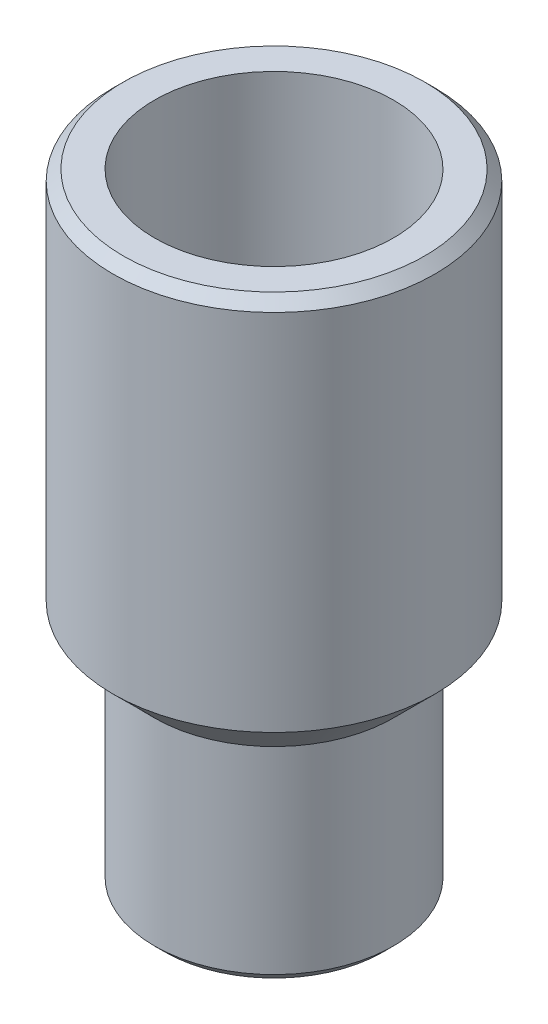
ISO-10303-21;
HEADER;
FILE_DESCRIPTION(('STEP AP214'),'2;1');
FILE_NAME('part.step','',(''),(''),'','','');
FILE_SCHEMA(('AUTOMOTIVE_DESIGN { 1 0 10303 214 1 1 1 1 }'));
ENDSEC;
DATA;
#1=APPLICATION_CONTEXT('core data for automotive mechanical design processes');
#2=APPLICATION_PROTOCOL_DEFINITION('international standard','automotive_design',2000,#1);
#3=PRODUCT_CONTEXT('',#1,'mechanical');
#4=PRODUCT('Part','Part','',(#3));
#5=PRODUCT_RELATED_PRODUCT_CATEGORY('part','',(#4));
#6=PRODUCT_DEFINITION_FORMATION('','',#4);
#7=PRODUCT_DEFINITION_CONTEXT('part definition',#1,'design');
#8=PRODUCT_DEFINITION('design','',#6,#7);
#9=PRODUCT_DEFINITION_SHAPE('','',#8);
#10=(LENGTH_UNIT() NAMED_UNIT(*) SI_UNIT(.MILLI.,.METRE.));
#11=(NAMED_UNIT(*) PLANE_ANGLE_UNIT() SI_UNIT($,.RADIAN.));
#12=(NAMED_UNIT(*) SI_UNIT($,.STERADIAN.) SOLID_ANGLE_UNIT());
#13=UNCERTAINTY_MEASURE_WITH_UNIT(LENGTH_MEASURE(1.E-05),#10,'distance_accuracy_value','');
#14=(GEOMETRIC_REPRESENTATION_CONTEXT(3) GLOBAL_UNCERTAINTY_ASSIGNED_CONTEXT((#13)) GLOBAL_UNIT_ASSIGNED_CONTEXT((#10,
#11,#12)) REPRESENTATION_CONTEXT('',''));
#15=CARTESIAN_POINT('',(0.,0.,0.));
#16=DIRECTION('',(0.,0.,1.));
#17=DIRECTION('',(1.,0.,0.));
#18=AXIS2_PLACEMENT_3D('',#15,#16,#17);
#19=CARTESIAN_POINT('',(49.,-179.,-49.));
#20=DIRECTION('',(0.,-1.,0.));
#21=DIRECTION('',(0.,0.,-1.));
#22=AXIS2_PLACEMENT_3D('',#19,#20,#21);
#23=CYLINDRICAL_SURFACE('',#22,7.75);
#24=CARTESIAN_POINT('',(49.,-179.5,-49.));
#25=DIRECTION('',(0.,-1.,0.));
#26=DIRECTION('',(0.,0.,-1.));
#27=AXIS2_PLACEMENT_3D('',#24,#25,#26);
#28=CIRCLE('',#27,7.75);
#29=CARTESIAN_POINT('',(49.,-179.5,-56.75));
#30=VERTEX_POINT('',#29);
#31=EDGE_CURVE('E46',#30,#30,#28,.T.);
#32=ORIENTED_EDGE('',*,*,#31,.T.);
#33=EDGE_LOOP('',(#32));
#34=FACE_BOUND('',#33,.T.);
#35=CARTESIAN_POINT('',(49.,-197.,-49.));
#36=DIRECTION('',(0.,-1.,0.));
#37=DIRECTION('',(0.,0.,-1.));
#38=AXIS2_PLACEMENT_3D('',#35,#36,#37);
#39=CIRCLE('',#38,7.75);
#40=CARTESIAN_POINT('',(49.,-197.,-56.75));
#41=VERTEX_POINT('',#40);
#42=EDGE_CURVE('E105',#41,#41,#39,.F.);
#43=ORIENTED_EDGE('',*,*,#42,.T.);
#44=EDGE_LOOP('',(#43));
#45=FACE_BOUND('',#44,.T.);
#46=ADVANCED_FACE('F32',(#34,#45),#23,.T.);
#47=CARTESIAN_POINT('',(49.,-179.,-49.));
#48=DIRECTION('',(0.,-1.,0.));
#49=DIRECTION('',(0.,0.,-1.));
#50=AXIS2_PLACEMENT_3D('',#47,#48,#49);
#51=PLANE('',#50);
#52=CARTESIAN_POINT('',(49.,-179.,-49.));
#53=DIRECTION('',(0.,-1.,0.));
#54=DIRECTION('',(0.,0.,-1.));
#55=AXIS2_PLACEMENT_3D('',#52,#53,#54);
#56=CIRCLE('',#55,7.24999999999999);
#57=CARTESIAN_POINT('',(49.,-179.,-56.25));
#58=VERTEX_POINT('',#57);
#59=EDGE_CURVE('E11',#58,#58,#56,.F.);
#60=ORIENTED_EDGE('',*,*,#59,.T.);
#61=EDGE_LOOP('',(#60));
#62=FACE_BOUND('',#61,.T.);
#63=CARTESIAN_POINT('',(49.,-179.,-49.));
#64=DIRECTION('',(0.,-1.,0.));
#65=DIRECTION('',(0.,0.,-1.));
#66=AXIS2_PLACEMENT_3D('',#63,#64,#65);
#67=CIRCLE('',#66,5.74999999999999);
#68=CARTESIAN_POINT('',(49.,-179.,-54.75));
#69=VERTEX_POINT('',#68);
#70=EDGE_CURVE('E99',#69,#69,#67,.T.);
#71=ORIENTED_EDGE('',*,*,#70,.T.);
#72=EDGE_LOOP('',(#71));
#73=FACE_BOUND('',#72,.T.);
#74=ADVANCED_FACE('F144',(#62,#73),#51,.F.);
#75=CARTESIAN_POINT('',(49.,-179.,-49.));
#76=DIRECTION('',(0.,-1.,0.));
#77=DIRECTION('',(0.,0.,-1.));
#78=AXIS2_PLACEMENT_3D('',#75,#76,#77);
#79=CYLINDRICAL_SURFACE('',#78,5.74999999999999);
#80=ORIENTED_EDGE('',*,*,#70,.F.);
#81=EDGE_LOOP('',(#80));
#82=FACE_BOUND('',#81,.T.);
#83=CARTESIAN_POINT('',(49.,-194.,-49.));
#84=DIRECTION('',(0.,-1.,0.));
#85=DIRECTION('',(0.,0.,-1.));
#86=AXIS2_PLACEMENT_3D('',#83,#84,#85);
#87=CIRCLE('',#86,5.74999999999999);
#88=CARTESIAN_POINT('',(49.,-194.,-54.75));
#89=VERTEX_POINT('',#88);
#90=EDGE_CURVE('E84',#89,#89,#87,.F.);
#91=ORIENTED_EDGE('',*,*,#90,.F.);
#92=EDGE_LOOP('',(#91));
#93=FACE_BOUND('',#92,.T.);
#94=ADVANCED_FACE('F150',(#82,#93),#79,.F.);
#95=CARTESIAN_POINT('',(49.,-194.,-49.));
#96=DIRECTION('',(0.,-1.,0.));
#97=DIRECTION('',(0.,0.,-1.));
#98=AXIS2_PLACEMENT_3D('',#95,#96,#97);
#99=PLANE('',#98);
#100=CARTESIAN_POINT('',(49.,-194.,-49.));
#101=DIRECTION('',(0.,-1.,0.));
#102=DIRECTION('',(0.,0.,-1.));
#103=AXIS2_PLACEMENT_3D('',#100,#101,#102);
#104=CIRCLE('',#103,2.6);
#105=CARTESIAN_POINT('',(51.1,-194.,-47.4670290283244));
#106=VERTEX_POINT('',#105);
#107=CARTESIAN_POINT('',(51.1,-194.,-50.5329709716756));
#108=VERTEX_POINT('',#107);
#109=EDGE_CURVE('E80',#106,#108,#104,.T.);
#110=ORIENTED_EDGE('',*,*,#109,.T.);
#111=DIRECTION('',(0.,0.,1.));
#112=VECTOR('',#111,1.);
#113=CARTESIAN_POINT('',(51.1,-194.,-47.4670290283244));
#114=LINE('',#113,#112);
#115=EDGE_CURVE('E87',#108,#106,#114,.T.);
#116=ORIENTED_EDGE('',*,*,#115,.T.);
#117=EDGE_LOOP('',(#110,#116));
#118=FACE_BOUND('',#117,.T.);
#119=ORIENTED_EDGE('',*,*,#90,.T.);
#120=EDGE_LOOP('',(#119));
#121=FACE_BOUND('',#120,.T.);
#122=ADVANCED_FACE('F91',(#118,#121),#99,.F.);
#123=CARTESIAN_POINT('',(49.,-199.,-49.));
#124=DIRECTION('',(0.,1.,0.));
#125=DIRECTION('',(0.,0.,1.));
#126=AXIS2_PLACEMENT_3D('',#123,#124,#125);
#127=CYLINDRICAL_SURFACE('',#126,2.6);
#128=DIRECTION('',(0.,1.,0.));
#129=VECTOR('',#128,1.);
#130=CARTESIAN_POINT('',(51.1,-199.,-47.4670290283244));
#131=LINE('',#130,#129);
#132=CARTESIAN_POINT('',(51.1,-208.5,-47.4670290283244));
#133=VERTEX_POINT('',#132);
#134=EDGE_CURVE('E85',#133,#106,#131,.T.);
#135=ORIENTED_EDGE('',*,*,#134,.F.);
#136=CARTESIAN_POINT('',(49.,-208.5,-49.));
#137=DIRECTION('',(0.,-1.,0.));
#138=DIRECTION('',(0.,0.,-1.));
#139=AXIS2_PLACEMENT_3D('',#136,#137,#138);
#140=CIRCLE('',#139,2.6);
#141=CARTESIAN_POINT('',(51.1,-208.5,-50.5329709716756));
#142=VERTEX_POINT('',#141);
#143=EDGE_CURVE('E82',#133,#142,#140,.T.);
#144=ORIENTED_EDGE('',*,*,#143,.T.);
#145=DIRECTION('',(0.,1.,0.));
#146=VECTOR('',#145,1.);
#147=CARTESIAN_POINT('',(51.1,-199.,-50.5329709716756));
#148=LINE('',#147,#146);
#149=EDGE_CURVE('E75',#142,#108,#148,.T.);
#150=ORIENTED_EDGE('',*,*,#149,.T.);
#151=ORIENTED_EDGE('',*,*,#109,.F.);
#152=EDGE_LOOP('',(#135,#144,#150,#151));
#153=FACE_BOUND('',#152,.T.);
#154=ADVANCED_FACE('F78',(#153),#127,.F.);
#155=CARTESIAN_POINT('',(51.1,-199.,-47.4670290283244));
#156=DIRECTION('',(-1.,0.,0.));
#157=DIRECTION('',(0.,0.,1.));
#158=AXIS2_PLACEMENT_3D('',#155,#156,#157);
#159=PLANE('',#158);
#160=ORIENTED_EDGE('',*,*,#149,.F.);
#161=DIRECTION('',(0.,0.,1.));
#162=VECTOR('',#161,1.);
#163=CARTESIAN_POINT('',(51.1,-208.5,-47.4670290283244));
#164=LINE('',#163,#162);
#165=EDGE_CURVE('E115',#142,#133,#164,.T.);
#166=ORIENTED_EDGE('',*,*,#165,.T.);
#167=ORIENTED_EDGE('',*,*,#134,.T.);
#168=ORIENTED_EDGE('',*,*,#115,.F.);
#169=EDGE_LOOP('',(#160,#166,#167,#168));
#170=FACE_BOUND('',#169,.T.);
#171=ADVANCED_FACE('F88',(#170),#159,.T.);
#172=CARTESIAN_POINT('',(49.,-199.,-49.));
#173=DIRECTION('',(0.,1.,0.));
#174=DIRECTION('',(0.,0.,1.));
#175=AXIS2_PLACEMENT_3D('',#172,#173,#174);
#176=CONICAL_SURFACE('',#175,5.74999999999998,0.785398163397446);
#177=ORIENTED_EDGE('',*,*,#42,.F.);
#178=EDGE_LOOP('',(#177));
#179=FACE_BOUND('',#178,.T.);
#180=CARTESIAN_POINT('',(49.,-199.,-49.));
#181=DIRECTION('',(0.,-1.,0.));
#182=DIRECTION('',(0.,0.,-1.));
#183=AXIS2_PLACEMENT_3D('',#180,#181,#182);
#184=CIRCLE('',#183,5.74999999999998);
#185=CARTESIAN_POINT('',(49.,-199.,-54.75));
#186=VERTEX_POINT('',#185);
#187=EDGE_CURVE('E102',#186,#186,#184,.T.);
#188=ORIENTED_EDGE('',*,*,#187,.F.);
#189=EDGE_LOOP('',(#188));
#190=FACE_BOUND('',#189,.T.);
#191=ADVANCED_FACE('F155',(#179,#190),#176,.T.);
#192=CARTESIAN_POINT('',(49.,-209.,-49.));
#193=DIRECTION('',(0.,-1.,0.));
#194=DIRECTION('',(0.,0.,-1.));
#195=AXIS2_PLACEMENT_3D('',#192,#193,#194);
#196=PLANE('',#195);
#197=DIRECTION('',(0.,0.,-1.));
#198=VECTOR('',#197,1.);
#199=CARTESIAN_POINT('',(51.6,-209.,-49.));
#200=LINE('',#199,#198);
#201=CARTESIAN_POINT('',(51.6,-209.,-47.3118056983866));
#202=VERTEX_POINT('',#201);
#203=CARTESIAN_POINT('',(51.6,-209.,-50.6881943016134));
#204=VERTEX_POINT('',#203);
#205=EDGE_CURVE('E53',#202,#204,#200,.T.);
#206=ORIENTED_EDGE('',*,*,#205,.T.);
#207=CARTESIAN_POINT('',(49.,-209.,-49.));
#208=DIRECTION('',(0.,-1.,0.));
#209=DIRECTION('',(0.,0.,-1.));
#210=AXIS2_PLACEMENT_3D('',#207,#208,#209);
#211=CIRCLE('',#210,3.1);
#212=EDGE_CURVE('E113',#204,#202,#211,.F.);
#213=ORIENTED_EDGE('',*,*,#212,.T.);
#214=EDGE_LOOP('',(#206,#213));
#215=FACE_BOUND('',#214,.T.);
#216=CARTESIAN_POINT('',(49.,-209.,-49.));
#217=DIRECTION('',(0.,-1.,0.));
#218=DIRECTION('',(0.,0.,-1.));
#219=AXIS2_PLACEMENT_3D('',#216,#217,#218);
#220=CIRCLE('',#219,5.25);
#221=CARTESIAN_POINT('',(49.,-209.,-54.25));
#222=VERTEX_POINT('',#221);
#223=EDGE_CURVE('E109',#222,#222,#220,.T.);
#224=ORIENTED_EDGE('',*,*,#223,.T.);
#225=EDGE_LOOP('',(#224));
#226=FACE_BOUND('',#225,.T.);
#227=ADVANCED_FACE('F157',(#215,#226),#196,.T.);
#228=CARTESIAN_POINT('',(49.,-209.,-49.));
#229=DIRECTION('',(0.,1.,0.));
#230=DIRECTION('',(0.,0.,1.));
#231=AXIS2_PLACEMENT_3D('',#228,#229,#230);
#232=CYLINDRICAL_SURFACE('',#231,5.74999999999999);
#233=CARTESIAN_POINT('',(49.,-208.5,-49.));
#234=DIRECTION('',(0.,-1.,0.));
#235=DIRECTION('',(0.,0.,-1.));
#236=AXIS2_PLACEMENT_3D('',#233,#234,#235);
#237=CIRCLE('',#236,5.74999999999999);
#238=CARTESIAN_POINT('',(49.,-208.5,-54.75));
#239=VERTEX_POINT('',#238);
#240=EDGE_CURVE('E117',#239,#239,#237,.F.);
#241=ORIENTED_EDGE('',*,*,#240,.T.);
#242=EDGE_LOOP('',(#241));
#243=FACE_BOUND('',#242,.T.);
#244=ORIENTED_EDGE('',*,*,#187,.T.);
#245=EDGE_LOOP('',(#244));
#246=FACE_BOUND('',#245,.T.);
#247=ADVANCED_FACE('F130',(#243,#246),#232,.T.);
#248=CARTESIAN_POINT('',(51.1,-208.5,-47.4670290283244));
#249=DIRECTION('',(0.707106781186542,0.707106781186552,0.));
#250=DIRECTION('',(0.,0.,1.));
#251=AXIS2_PLACEMENT_3D('',#248,#249,#250);
#252=PLANE('',#251);
#253=CARTESIAN_POINT('',(51.1,-208.5,-50.5329709716756));
#254=CARTESIAN_POINT('',(51.1831490013698,-208.58314900137,-50.5600303109591));
#255=CARTESIAN_POINT('',(51.2663902619847,-208.666390261985,-50.5864952856575));
#256=CARTESIAN_POINT('',(51.4330569294756,-208.833056929476,-50.6382363903271));
#257=CARTESIAN_POINT('',(51.5164823355273,-208.916482335527,-50.6635125256079));
#258=CARTESIAN_POINT('',(51.6,-209.,-50.6881943016134));
#259=B_SPLINE_CURVE_WITH_KNOTS('',3,(#253,#254,#255,#256,#257,#258),.UNSPECIFIED.,.F.,.F.,(4,2,
4),(0.,0.361977193217799,0.723952769577258),.UNSPECIFIED.);
#260=EDGE_CURVE('E94',#204,#142,#259,.F.);
#261=ORIENTED_EDGE('',*,*,#260,.F.);
#262=ORIENTED_EDGE('',*,*,#205,.F.);
#263=CARTESIAN_POINT('',(51.6,-209.,-47.3118056983866));
#264=CARTESIAN_POINT('',(51.5164823355273,-208.916482335527,-47.3364874743921));
#265=CARTESIAN_POINT('',(51.4330569294756,-208.833056929476,-47.3617636096729));
#266=CARTESIAN_POINT('',(51.2663902619847,-208.666390261985,-47.4135047143425));
#267=CARTESIAN_POINT('',(51.1831490013698,-208.58314900137,-47.439969689041));
#268=CARTESIAN_POINT('',(51.1,-208.5,-47.4670290283244));
#269=B_SPLINE_CURVE_WITH_KNOTS('',3,(#263,#264,#265,#266,#267,#268),.UNSPECIFIED.,.F.,.F.,(4,2,
4),(0.,0.361975576359459,0.723952769577253),.UNSPECIFIED.);
#270=EDGE_CURVE('E36',#133,#202,#269,.F.);
#271=ORIENTED_EDGE('',*,*,#270,.F.);
#272=ORIENTED_EDGE('',*,*,#165,.F.);
#273=EDGE_LOOP('',(#261,#262,#271,#272));
#274=FACE_BOUND('',#273,.T.);
#275=ADVANCED_FACE('F127',(#274),#252,.F.);
#276=CARTESIAN_POINT('',(49.,-208.5,-49.));
#277=DIRECTION('',(0.,-1.,0.));
#278=DIRECTION('',(0.,0.,-1.));
#279=AXIS2_PLACEMENT_3D('',#276,#277,#278);
#280=CONICAL_SURFACE('',#279,2.6,0.785398163397454);
#281=ORIENTED_EDGE('',*,*,#270,.T.);
#282=ORIENTED_EDGE('',*,*,#212,.F.);
#283=ORIENTED_EDGE('',*,*,#260,.T.);
#284=ORIENTED_EDGE('',*,*,#143,.F.);
#285=EDGE_LOOP('',(#281,#282,#283,#284));
#286=FACE_BOUND('',#285,.T.);
#287=ADVANCED_FACE('F124',(#286),#280,.F.);
#288=CARTESIAN_POINT('',(49.,-209.,-49.));
#289=DIRECTION('',(0.,1.,0.));
#290=DIRECTION('',(0.,0.,1.));
#291=AXIS2_PLACEMENT_3D('',#288,#289,#290);
#292=CONICAL_SURFACE('',#291,5.25,0.785398163397432);
#293=ORIENTED_EDGE('',*,*,#240,.F.);
#294=EDGE_LOOP('',(#293));
#295=FACE_BOUND('',#294,.T.);
#296=ORIENTED_EDGE('',*,*,#223,.F.);
#297=EDGE_LOOP('',(#296));
#298=FACE_BOUND('',#297,.T.);
#299=ADVANCED_FACE('F132',(#295,#298),#292,.T.);
#300=CARTESIAN_POINT('',(49.,-179.5,-49.));
#301=DIRECTION('',(0.,-1.,0.));
#302=DIRECTION('',(0.,0.,-1.));
#303=AXIS2_PLACEMENT_3D('',#300,#301,#302);
#304=CONICAL_SURFACE('',#303,7.75,0.785398163397426);
#305=ORIENTED_EDGE('',*,*,#59,.F.);
#306=EDGE_LOOP('',(#305));
#307=FACE_BOUND('',#306,.T.);
#308=ORIENTED_EDGE('',*,*,#31,.F.);
#309=EDGE_LOOP('',(#308));
#310=FACE_BOUND('',#309,.T.);
#311=ADVANCED_FACE('F34',(#307,#310),#304,.T.);
#312=CLOSED_SHELL('',(#46,#74,#94,#122,#154,#171,#191,#227,#247,#275,#287,#299,#311));
#313=MANIFOLD_SOLID_BREP('B2',#312);
#314=ADVANCED_BREP_SHAPE_REPRESENTATION('',(#18,#313),#14);
#315=SHAPE_DEFINITION_REPRESENTATION(#9,#314);
ENDSEC;
END-ISO-10303-21;
